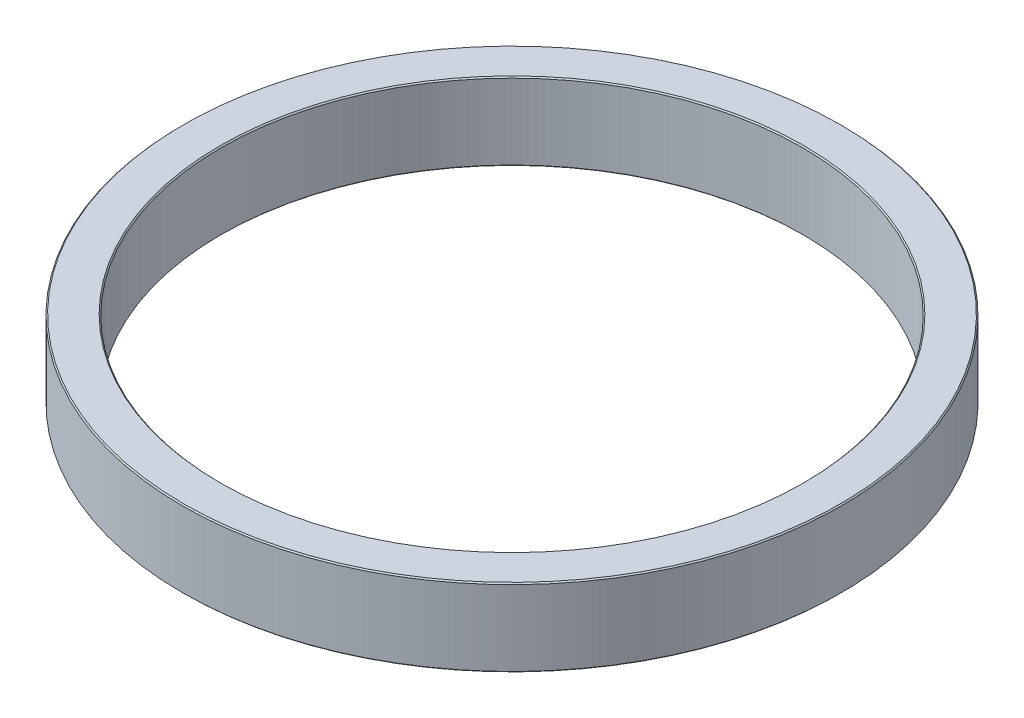
ISO-10303-21;
HEADER;
FILE_DESCRIPTION(('STEP AP214'),'2;1');
FILE_NAME('part.step','',(''),(''),'','','');
FILE_SCHEMA(('AUTOMOTIVE_DESIGN { 1 0 10303 214 1 1 1 1 }'));
ENDSEC;
DATA;
#1=APPLICATION_CONTEXT('core data for automotive mechanical design processes');
#2=APPLICATION_PROTOCOL_DEFINITION('international standard','automotive_design',2000,#1);
#3=PRODUCT_CONTEXT('',#1,'mechanical');
#4=PRODUCT('Part','Part','',(#3));
#5=PRODUCT_RELATED_PRODUCT_CATEGORY('part','',(#4));
#6=PRODUCT_DEFINITION_FORMATION('','',#4);
#7=PRODUCT_DEFINITION_CONTEXT('part definition',#1,'design');
#8=PRODUCT_DEFINITION('design','',#6,#7);
#9=PRODUCT_DEFINITION_SHAPE('','',#8);
#10=(LENGTH_UNIT() NAMED_UNIT(*) SI_UNIT(.MILLI.,.METRE.));
#11=(NAMED_UNIT(*) PLANE_ANGLE_UNIT() SI_UNIT($,.RADIAN.));
#12=(NAMED_UNIT(*) SI_UNIT($,.STERADIAN.) SOLID_ANGLE_UNIT());
#13=UNCERTAINTY_MEASURE_WITH_UNIT(LENGTH_MEASURE(1.E-05),#10,'distance_accuracy_value','');
#14=(GEOMETRIC_REPRESENTATION_CONTEXT(3) GLOBAL_UNCERTAINTY_ASSIGNED_CONTEXT((#13)) GLOBAL_UNIT_ASSIGNED_CONTEXT((#10,
#11,#12)) REPRESENTATION_CONTEXT('',''));
#15=CARTESIAN_POINT('',(0.,0.,0.));
#16=DIRECTION('',(0.,0.,1.));
#17=DIRECTION('',(1.,0.,0.));
#18=AXIS2_PLACEMENT_3D('',#15,#16,#17);
#19=CARTESIAN_POINT('',(0.,10.,0.));
#20=DIRECTION('',(0.,1.,0.));
#21=DIRECTION('',(0.,0.,1.));
#22=AXIS2_PLACEMENT_3D('',#19,#20,#21);
#23=PLANE('',#22);
#24=CARTESIAN_POINT('',(0.,10.,0.));
#25=DIRECTION('',(0.,1.,0.));
#26=DIRECTION('',(0.,0.,1.));
#27=AXIS2_PLACEMENT_3D('',#24,#25,#26);
#28=CIRCLE('',#27,42.35);
#29=CARTESIAN_POINT('',(0.,10.,42.35));
#30=VERTEX_POINT('',#29);
#31=EDGE_CURVE('E45',#30,#30,#28,.T.);
#32=ORIENTED_EDGE('',*,*,#31,.T.);
#33=EDGE_LOOP('',(#32));
#34=FACE_BOUND('',#33,.T.);
#35=CARTESIAN_POINT('',(0.,10.,0.));
#36=DIRECTION('',(0.,1.,0.));
#37=DIRECTION('',(0.,0.,1.));
#38=AXIS2_PLACEMENT_3D('',#35,#36,#37);
#39=CIRCLE('',#38,37.65);
#40=CARTESIAN_POINT('',(0.,10.,37.65));
#41=VERTEX_POINT('',#40);
#42=EDGE_CURVE('E49',#41,#41,#39,.F.);
#43=ORIENTED_EDGE('',*,*,#42,.T.);
#44=EDGE_LOOP('',(#43));
#45=FACE_BOUND('',#44,.T.);
#46=ADVANCED_FACE('F33',(#34,#45),#23,.T.);
#47=CARTESIAN_POINT('',(0.,0.,0.));
#48=DIRECTION('',(0.,1.,0.));
#49=DIRECTION('',(0.,0.,1.));
#50=AXIS2_PLACEMENT_3D('',#47,#48,#49);
#51=PLANE('',#50);
#52=CARTESIAN_POINT('',(0.,0.,0.));
#53=DIRECTION('',(0.,1.,0.));
#54=DIRECTION('',(0.,0.,1.));
#55=AXIS2_PLACEMENT_3D('',#52,#53,#54);
#56=CIRCLE('',#55,42.35);
#57=CARTESIAN_POINT('',(0.,0.,42.35));
#58=VERTEX_POINT('',#57);
#59=EDGE_CURVE('E54',#58,#58,#56,.F.);
#60=ORIENTED_EDGE('',*,*,#59,.T.);
#61=EDGE_LOOP('',(#60));
#62=FACE_BOUND('',#61,.T.);
#63=CARTESIAN_POINT('',(0.,0.,0.));
#64=DIRECTION('',(0.,1.,0.));
#65=DIRECTION('',(0.,0.,1.));
#66=AXIS2_PLACEMENT_3D('',#63,#64,#65);
#67=CIRCLE('',#66,37.65);
#68=CARTESIAN_POINT('',(0.,0.,37.65));
#69=VERTEX_POINT('',#68);
#70=EDGE_CURVE('E57',#69,#69,#67,.T.);
#71=ORIENTED_EDGE('',*,*,#70,.T.);
#72=EDGE_LOOP('',(#71));
#73=FACE_BOUND('',#72,.T.);
#74=ADVANCED_FACE('F79',(#62,#73),#51,.F.);
#75=CARTESIAN_POINT('',(0.,10.,0.));
#76=DIRECTION('',(0.,-1.,0.));
#77=DIRECTION('',(0.,0.,-1.));
#78=AXIS2_PLACEMENT_3D('',#75,#76,#77);
#79=CYLINDRICAL_SURFACE('',#78,42.5);
#80=CARTESIAN_POINT('',(0.,0.14999999999999,0.));
#81=DIRECTION('',(0.,1.,0.));
#82=DIRECTION('',(0.,0.,1.));
#83=AXIS2_PLACEMENT_3D('',#80,#81,#82);
#84=CIRCLE('',#83,42.5);
#85=CARTESIAN_POINT('',(0.,0.14999999999999,42.5));
#86=VERTEX_POINT('',#85);
#87=EDGE_CURVE('E60',#86,#86,#84,.T.);
#88=ORIENTED_EDGE('',*,*,#87,.T.);
#89=EDGE_LOOP('',(#88));
#90=FACE_BOUND('',#89,.T.);
#91=CARTESIAN_POINT('',(0.,9.85000000000002,0.));
#92=DIRECTION('',(0.,1.,0.));
#93=DIRECTION('',(0.,0.,1.));
#94=AXIS2_PLACEMENT_3D('',#91,#92,#93);
#95=CIRCLE('',#94,42.5);
#96=CARTESIAN_POINT('',(0.,9.85000000000002,42.5));
#97=VERTEX_POINT('',#96);
#98=EDGE_CURVE('E63',#97,#97,#95,.F.);
#99=ORIENTED_EDGE('',*,*,#98,.T.);
#100=EDGE_LOOP('',(#99));
#101=FACE_BOUND('',#100,.T.);
#102=ADVANCED_FACE('F67',(#90,#101),#79,.T.);
#103=CARTESIAN_POINT('',(0.,10.,0.));
#104=DIRECTION('',(0.,-1.,0.));
#105=DIRECTION('',(0.,0.,-1.));
#106=AXIS2_PLACEMENT_3D('',#103,#104,#105);
#107=CYLINDRICAL_SURFACE('',#106,37.5);
#108=CARTESIAN_POINT('',(0.,0.150000000000004,0.));
#109=DIRECTION('',(0.,1.,0.));
#110=DIRECTION('',(0.,0.,1.));
#111=AXIS2_PLACEMENT_3D('',#108,#109,#110);
#112=CIRCLE('',#111,37.5);
#113=CARTESIAN_POINT('',(0.,0.150000000000004,37.5));
#114=VERTEX_POINT('',#113);
#115=EDGE_CURVE('E10',#114,#114,#112,.F.);
#116=ORIENTED_EDGE('',*,*,#115,.T.);
#117=EDGE_LOOP('',(#116));
#118=FACE_BOUND('',#117,.T.);
#119=CARTESIAN_POINT('',(0.,9.84999999999998,0.));
#120=DIRECTION('',(0.,1.,0.));
#121=DIRECTION('',(0.,0.,1.));
#122=AXIS2_PLACEMENT_3D('',#119,#120,#121);
#123=CIRCLE('',#122,37.5);
#124=CARTESIAN_POINT('',(0.,9.84999999999998,37.5));
#125=VERTEX_POINT('',#124);
#126=EDGE_CURVE('E41',#125,#125,#123,.T.);
#127=ORIENTED_EDGE('',*,*,#126,.T.);
#128=EDGE_LOOP('',(#127));
#129=FACE_BOUND('',#128,.T.);
#130=ADVANCED_FACE('F104',(#118,#129),#107,.F.);
#131=CARTESIAN_POINT('',(0.,0.14999999999999,0.));
#132=DIRECTION('',(0.,1.,0.));
#133=DIRECTION('',(0.,0.,1.));
#134=AXIS2_PLACEMENT_3D('',#131,#132,#133);
#135=CONICAL_SURFACE('',#134,42.5,0.785398163397402);
#136=ORIENTED_EDGE('',*,*,#59,.F.);
#137=EDGE_LOOP('',(#136));
#138=FACE_BOUND('',#137,.T.);
#139=ORIENTED_EDGE('',*,*,#87,.F.);
#140=EDGE_LOOP('',(#139));
#141=FACE_BOUND('',#140,.T.);
#142=ADVANCED_FACE('F73',(#138,#141),#135,.T.);
#143=CARTESIAN_POINT('',(0.,10.,0.));
#144=DIRECTION('',(0.,-1.,0.));
#145=DIRECTION('',(0.,0.,-1.));
#146=AXIS2_PLACEMENT_3D('',#143,#144,#145);
#147=CONICAL_SURFACE('',#146,42.35,0.785398163397425);
#148=ORIENTED_EDGE('',*,*,#98,.F.);
#149=EDGE_LOOP('',(#148));
#150=FACE_BOUND('',#149,.T.);
#151=ORIENTED_EDGE('',*,*,#31,.F.);
#152=EDGE_LOOP('',(#151));
#153=FACE_BOUND('',#152,.T.);
#154=ADVANCED_FACE('F69',(#150,#153),#147,.T.);
#155=CARTESIAN_POINT('',(0.,0.,0.));
#156=DIRECTION('',(0.,-1.,0.));
#157=DIRECTION('',(0.,0.,-1.));
#158=AXIS2_PLACEMENT_3D('',#155,#156,#157);
#159=CONICAL_SURFACE('',#158,37.65,0.785398163397425);
#160=ORIENTED_EDGE('',*,*,#115,.F.);
#161=EDGE_LOOP('',(#160));
#162=FACE_BOUND('',#161,.T.);
#163=ORIENTED_EDGE('',*,*,#70,.F.);
#164=EDGE_LOOP('',(#163));
#165=FACE_BOUND('',#164,.T.);
#166=ADVANCED_FACE('F72',(#162,#165),#159,.F.);
#167=CARTESIAN_POINT('',(0.,9.84999999999998,0.));
#168=DIRECTION('',(0.,1.,0.));
#169=DIRECTION('',(0.,0.,1.));
#170=AXIS2_PLACEMENT_3D('',#167,#168,#169);
#171=CONICAL_SURFACE('',#170,37.5,0.785398163397425);
#172=ORIENTED_EDGE('',*,*,#42,.F.);
#173=EDGE_LOOP('',(#172));
#174=FACE_BOUND('',#173,.T.);
#175=ORIENTED_EDGE('',*,*,#126,.F.);
#176=EDGE_LOOP('',(#175));
#177=FACE_BOUND('',#176,.T.);
#178=ADVANCED_FACE('F36',(#174,#177),#171,.F.);
#179=CLOSED_SHELL('',(#46,#74,#102,#130,#142,#154,#166,#178));
#180=MANIFOLD_SOLID_BREP('B2',#179);
#181=ADVANCED_BREP_SHAPE_REPRESENTATION('',(#18,#180),#14);
#182=SHAPE_DEFINITION_REPRESENTATION(#9,#181);
ENDSEC;
END-ISO-10303-21;
